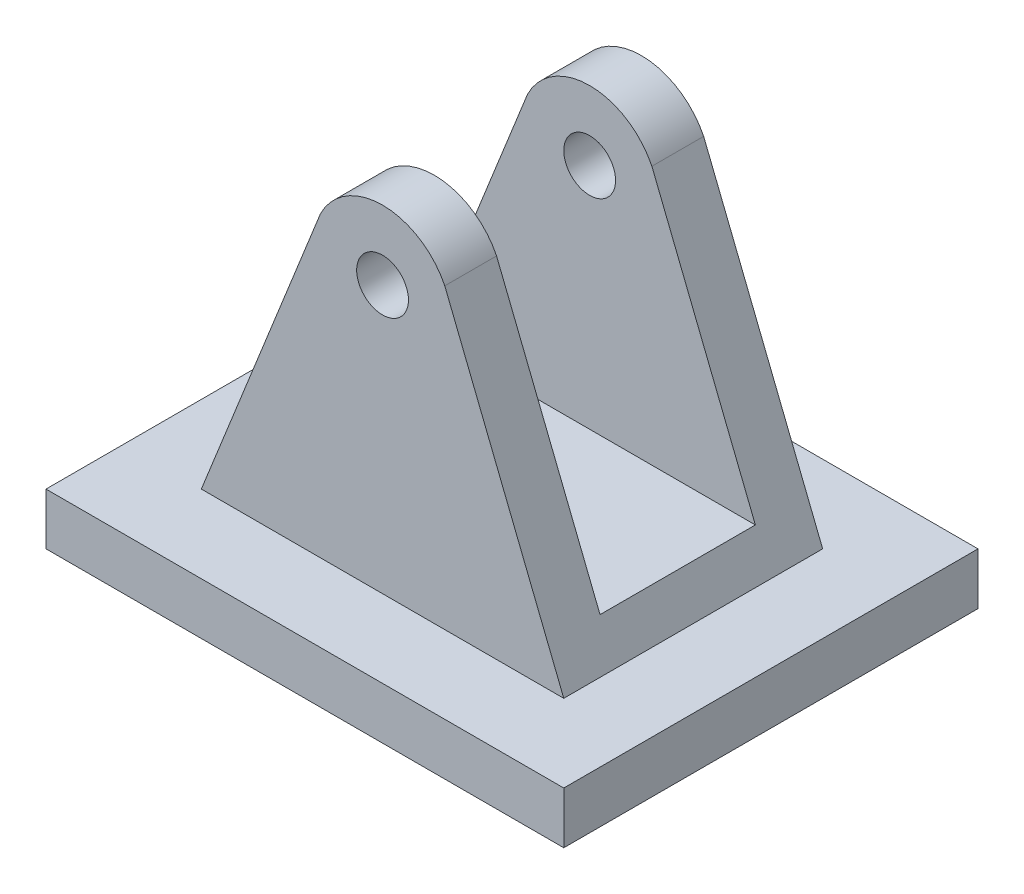
ISO-10303-21;
HEADER;
FILE_DESCRIPTION(('STEP AP214'),'2;1');
FILE_NAME('part.step','',(''),(''),'','','');
FILE_SCHEMA(('AUTOMOTIVE_DESIGN { 1 0 10303 214 1 1 1 1 }'));
ENDSEC;
DATA;
#1=APPLICATION_CONTEXT('core data for automotive mechanical design processes');
#2=APPLICATION_PROTOCOL_DEFINITION('international standard','automotive_design',2000,#1);
#3=PRODUCT_CONTEXT('',#1,'mechanical');
#4=PRODUCT('Part','Part','',(#3));
#5=PRODUCT_RELATED_PRODUCT_CATEGORY('part','',(#4));
#6=PRODUCT_DEFINITION_FORMATION('','',#4);
#7=PRODUCT_DEFINITION_CONTEXT('part definition',#1,'design');
#8=PRODUCT_DEFINITION('design','',#6,#7);
#9=PRODUCT_DEFINITION_SHAPE('','',#8);
#10=(LENGTH_UNIT() NAMED_UNIT(*) SI_UNIT(.MILLI.,.METRE.));
#11=(NAMED_UNIT(*) PLANE_ANGLE_UNIT() SI_UNIT($,.RADIAN.));
#12=(NAMED_UNIT(*) SI_UNIT($,.STERADIAN.) SOLID_ANGLE_UNIT());
#13=UNCERTAINTY_MEASURE_WITH_UNIT(LENGTH_MEASURE(1.E-05),#10,'distance_accuracy_value','');
#14=(GEOMETRIC_REPRESENTATION_CONTEXT(3) GLOBAL_UNCERTAINTY_ASSIGNED_CONTEXT((#13)) GLOBAL_UNIT_ASSIGNED_CONTEXT((#10,
#11,#12)) REPRESENTATION_CONTEXT('',''));
#15=CARTESIAN_POINT('',(0.,0.,0.));
#16=DIRECTION('',(0.,0.,1.));
#17=DIRECTION('',(1.,0.,0.));
#18=AXIS2_PLACEMENT_3D('',#15,#16,#17);
#19=CARTESIAN_POINT('',(-54.281045751634,75.,28.0718954248366));
#20=DIRECTION('',(0.,0.,-1.));
#21=DIRECTION('',(-1.,0.,0.));
#22=AXIS2_PLACEMENT_3D('',#19,#20,#21);
#23=PLANE('',#22);
#24=DIRECTION('',(-0.371153744479045,0.928571428571429,0.));
#25=VECTOR('',#24,1.);
#26=CARTESIAN_POINT('',(17.0000157292129,6.79497483980002,28.0718954248366));
#27=LINE('',#26,#25);
#28=CARTESIAN_POINT('',(15.718954248366,9.99999999999999,28.0718954248366));
#29=VERTEX_POINT('',#28);
#30=CARTESIAN_POINT('',(-7.26449090351148,67.5011590631464,28.0718954248366));
#31=VERTEX_POINT('',#30);
#32=EDGE_CURVE('E210',#29,#31,#27,.T.);
#33=ORIENTED_EDGE('',*,*,#32,.T.);
#34=CARTESIAN_POINT('',(-19.281045751634,61.6225855766485,28.0718954248366));
#35=DIRECTION('',(0.,0.,1.));
#36=DIRECTION('',(1.,0.,0.));
#37=AXIS2_PLACEMENT_3D('',#34,#35,#36);
#38=CIRCLE('',#37,13.3774144233515);
#39=CARTESIAN_POINT('',(-31.2976005997565,67.5011590631464,28.0718954248366));
#40=VERTEX_POINT('',#39);
#41=EDGE_CURVE('E197',#40,#31,#38,.F.);
#42=ORIENTED_EDGE('',*,*,#41,.F.);
#43=DIRECTION('',(0.371153744479045,0.928571428571429,0.));
#44=VECTOR('',#43,1.);
#45=CARTESIAN_POINT('',(-50.2499823825408,20.0851205921543,28.0718954248366));
#46=LINE('',#45,#44);
#47=CARTESIAN_POINT('',(-54.281045751634,9.99999999999999,28.0718954248366));
#48=VERTEX_POINT('',#47);
#49=EDGE_CURVE('E205',#48,#40,#46,.T.);
#50=ORIENTED_EDGE('',*,*,#49,.F.);
#51=DIRECTION('',(1.,0.,0.));
#52=VECTOR('',#51,1.);
#53=CARTESIAN_POINT('',(-54.281045751634,10.,28.0718954248366));
#54=LINE('',#53,#52);
#55=EDGE_CURVE('E219',#48,#29,#54,.T.);
#56=ORIENTED_EDGE('',*,*,#55,.T.);
#57=EDGE_LOOP('',(#33,#42,#50,#56));
#58=FACE_BOUND('',#57,.T.);
#59=CARTESIAN_POINT('',(-19.281045751634,61.6225855766485,28.0718954248366));
#60=DIRECTION('',(0.,0.,1.));
#61=DIRECTION('',(1.,0.,0.));
#62=AXIS2_PLACEMENT_3D('',#59,#60,#61);
#63=CIRCLE('',#62,5.);
#64=CARTESIAN_POINT('',(-14.281045751634,61.6225855766485,28.0718954248366));
#65=VERTEX_POINT('',#64);
#66=EDGE_CURVE('E221',#65,#65,#63,.T.);
#67=ORIENTED_EDGE('',*,*,#66,.F.);
#68=EDGE_LOOP('',(#67));
#69=FACE_BOUND('',#68,.T.);
#70=ADVANCED_FACE('F96',(#58,#69),#23,.F.);
#71=CARTESIAN_POINT('',(-54.281045751634,75.,-21.9281045751634));
#72=DIRECTION('',(0.,0.,1.));
#73=DIRECTION('',(1.,0.,0.));
#74=AXIS2_PLACEMENT_3D('',#71,#72,#73);
#75=PLANE('',#74);
#76=DIRECTION('',(-0.371153744479045,0.928571428571429,0.));
#77=VECTOR('',#76,1.);
#78=CARTESIAN_POINT('',(-16.3256824719764,90.1709117584849,-21.9281045751634));
#79=LINE('',#78,#77);
#80=CARTESIAN_POINT('',(15.718954248366,9.99999999999999,-21.9281045751634));
#81=VERTEX_POINT('',#80);
#82=CARTESIAN_POINT('',(-7.26449090351148,67.5011590631464,-21.9281045751634));
#83=VERTEX_POINT('',#82);
#84=EDGE_CURVE('E233',#81,#83,#79,.T.);
#85=ORIENTED_EDGE('',*,*,#84,.F.);
#86=DIRECTION('',(-1.,0.,0.));
#87=VECTOR('',#86,1.);
#88=CARTESIAN_POINT('',(-54.281045751634,10.,-21.9281045751634));
#89=LINE('',#88,#87);
#90=CARTESIAN_POINT('',(-54.281045751634,9.99999999999999,-21.9281045751634));
#91=VERTEX_POINT('',#90);
#92=EDGE_CURVE('E284',#81,#91,#89,.T.);
#93=ORIENTED_EDGE('',*,*,#92,.T.);
#94=DIRECTION('',(0.371153744479045,0.928571428571429,0.));
#95=VECTOR('',#94,1.);
#96=CARTESIAN_POINT('',(-31.8792661741488,66.0459183673469,-21.9281045751634));
#97=LINE('',#96,#95);
#98=CARTESIAN_POINT('',(-31.2976005997565,67.5011590631464,-21.9281045751634));
#99=VERTEX_POINT('',#98);
#100=EDGE_CURVE('E257',#91,#99,#97,.T.);
#101=ORIENTED_EDGE('',*,*,#100,.T.);
#102=CARTESIAN_POINT('',(-19.281045751634,61.6225855766485,-21.9281045751634));
#103=DIRECTION('',(0.,0.,1.));
#104=DIRECTION('',(1.,0.,0.));
#105=AXIS2_PLACEMENT_3D('',#102,#103,#104);
#106=CIRCLE('',#105,13.3774144233515);
#107=EDGE_CURVE('E265',#99,#83,#106,.F.);
#108=ORIENTED_EDGE('',*,*,#107,.T.);
#109=EDGE_LOOP('',(#85,#93,#101,#108));
#110=FACE_BOUND('',#109,.T.);
#111=CARTESIAN_POINT('',(-19.281045751634,61.6225855766485,-21.9281045751634));
#112=DIRECTION('',(0.,0.,1.));
#113=DIRECTION('',(1.,0.,0.));
#114=AXIS2_PLACEMENT_3D('',#111,#112,#113);
#115=CIRCLE('',#114,5.);
#116=CARTESIAN_POINT('',(-14.281045751634,61.6225855766485,-21.9281045751634));
#117=VERTEX_POINT('',#116);
#118=EDGE_CURVE('E240',#117,#117,#115,.T.);
#119=ORIENTED_EDGE('',*,*,#118,.T.);
#120=EDGE_LOOP('',(#119));
#121=FACE_BOUND('',#120,.T.);
#122=ADVANCED_FACE('F354',(#110,#121),#75,.F.);
#123=CARTESIAN_POINT('',(-78.281045751634,17.5,-11.9281045751634));
#124=DIRECTION('',(0.,-1.,0.));
#125=DIRECTION('',(0.,0.,-1.));
#126=AXIS2_PLACEMENT_3D('',#123,#124,#125);
#127=PLANE('',#126);
#128=DIRECTION('',(0.,0.,1.));
#129=VECTOR('',#128,1.);
#130=CARTESIAN_POINT('',(12.7211740044968,17.5,-11.9281045751634));
#131=LINE('',#130,#129);
#132=CARTESIAN_POINT('',(12.7211740044968,17.5,-11.9281045751634));
#133=VERTEX_POINT('',#132);
#134=CARTESIAN_POINT('',(12.7211740044968,17.5,18.0718954248366));
#135=VERTEX_POINT('',#134);
#136=EDGE_CURVE('E227',#133,#135,#131,.T.);
#137=ORIENTED_EDGE('',*,*,#136,.F.);
#138=DIRECTION('',(1.,0.,0.));
#139=VECTOR('',#138,1.);
#140=CARTESIAN_POINT('',(-78.281045751634,17.5,-11.9281045751634));
#141=LINE('',#140,#139);
#142=CARTESIAN_POINT('',(-51.2832655077648,17.5,-11.9281045751634));
#143=VERTEX_POINT('',#142);
#144=EDGE_CURVE('E269',#143,#133,#141,.T.);
#145=ORIENTED_EDGE('',*,*,#144,.F.);
#146=DIRECTION('',(0.,0.,1.));
#147=VECTOR('',#146,1.);
#148=CARTESIAN_POINT('',(-51.2832655077648,17.5,-11.9281045751634));
#149=LINE('',#148,#147);
#150=CARTESIAN_POINT('',(-51.2832655077648,17.5,18.0718954248366));
#151=VERTEX_POINT('',#150);
#152=EDGE_CURVE('E249',#143,#151,#149,.T.);
#153=ORIENTED_EDGE('',*,*,#152,.T.);
#154=DIRECTION('',(1.,0.,0.));
#155=VECTOR('',#154,1.);
#156=CARTESIAN_POINT('',(-78.281045751634,17.5,18.0718954248366));
#157=LINE('',#156,#155);
#158=EDGE_CURVE('E268',#151,#135,#157,.T.);
#159=ORIENTED_EDGE('',*,*,#158,.T.);
#160=EDGE_LOOP('',(#137,#145,#153,#159));
#161=FACE_BOUND('',#160,.T.);
#162=ADVANCED_FACE('F336',(#161),#127,.F.);
#163=CARTESIAN_POINT('',(-78.281045751634,67.5,-11.9281045751634));
#164=DIRECTION('',(0.,0.,-1.));
#165=DIRECTION('',(0.,1.,0.));
#166=AXIS2_PLACEMENT_3D('',#163,#164,#165);
#167=PLANE('',#166);
#168=DIRECTION('',(0.371153744479045,-0.928571428571429,0.));
#169=VECTOR('',#168,1.);
#170=CARTESIAN_POINT('',(-17.0469842004769,91.975501329324,-11.9281045751634));
#171=LINE('',#170,#169);
#172=CARTESIAN_POINT('',(-7.26449090351148,67.5011590631464,-11.9281045751634));
#173=VERTEX_POINT('',#172);
#174=EDGE_CURVE('E230',#173,#133,#171,.T.);
#175=ORIENTED_EDGE('',*,*,#174,.F.);
#176=CARTESIAN_POINT('',(-19.281045751634,61.6225855766485,-11.9281045751634));
#177=DIRECTION('',(0.,0.,-1.));
#178=DIRECTION('',(0.,1.,0.));
#179=AXIS2_PLACEMENT_3D('',#176,#177,#178);
#180=CIRCLE('',#179,13.3774144233515);
#181=CARTESIAN_POINT('',(-31.2976005997565,67.5011590631464,-11.9281045751634));
#182=VERTEX_POINT('',#181);
#183=EDGE_CURVE('E261',#173,#182,#180,.F.);
#184=ORIENTED_EDGE('',*,*,#183,.T.);
#185=DIRECTION('',(-0.371153744479045,-0.928571428571429,0.));
#186=VECTOR('',#185,1.);
#187=CARTESIAN_POINT('',(-37.7702093436074,51.30765532712,-11.9281045751634));
#188=LINE('',#187,#186);
#189=EDGE_CURVE('E253',#182,#143,#188,.T.);
#190=ORIENTED_EDGE('',*,*,#189,.T.);
#191=ORIENTED_EDGE('',*,*,#144,.T.);
#192=EDGE_LOOP('',(#175,#184,#190,#191));
#193=FACE_BOUND('',#192,.T.);
#194=CARTESIAN_POINT('',(-19.281045751634,61.6225855766485,-11.9281045751634));
#195=DIRECTION('',(0.,0.,-1.));
#196=DIRECTION('',(0.,1.,0.));
#197=AXIS2_PLACEMENT_3D('',#194,#195,#196);
#198=CIRCLE('',#197,5.);
#199=CARTESIAN_POINT('',(-19.281045751634,66.6225855766485,-11.9281045751634));
#200=VERTEX_POINT('',#199);
#201=EDGE_CURVE('E236',#200,#200,#198,.T.);
#202=ORIENTED_EDGE('',*,*,#201,.T.);
#203=EDGE_LOOP('',(#202));
#204=FACE_BOUND('',#203,.T.);
#205=ADVANCED_FACE('F339',(#193,#204),#167,.F.);
#206=CARTESIAN_POINT('',(-78.281045751634,17.5,18.0718954248366));
#207=DIRECTION('',(0.,0.,1.));
#208=DIRECTION('',(1.,0.,0.));
#209=AXIS2_PLACEMENT_3D('',#206,#207,#208);
#210=PLANE('',#209);
#211=DIRECTION('',(-0.371153744479045,0.928571428571429,0.));
#212=VECTOR('',#211,1.);
#213=CARTESIAN_POINT('',(0.185153936050203,48.8632564313648,18.0718954248366));
#214=LINE('',#213,#212);
#215=CARTESIAN_POINT('',(-7.26449090351148,67.5011590631464,18.0718954248366));
#216=VERTEX_POINT('',#215);
#217=EDGE_CURVE('E12',#135,#216,#214,.T.);
#218=ORIENTED_EDGE('',*,*,#217,.F.);
#219=ORIENTED_EDGE('',*,*,#158,.F.);
#220=DIRECTION('',(0.371153744479045,0.928571428571429,0.));
#221=VECTOR('',#220,1.);
#222=CARTESIAN_POINT('',(-55.0023474801345,8.19541042916087,18.0718954248366));
#223=LINE('',#222,#221);
#224=CARTESIAN_POINT('',(-31.2976005997565,67.5011590631464,18.0718954248366));
#225=VERTEX_POINT('',#224);
#226=EDGE_CURVE('E323',#151,#225,#223,.T.);
#227=ORIENTED_EDGE('',*,*,#226,.T.);
#228=CARTESIAN_POINT('',(-19.281045751634,61.6225855766485,18.0718954248366));
#229=DIRECTION('',(0.,0.,1.));
#230=DIRECTION('',(1.,0.,0.));
#231=AXIS2_PLACEMENT_3D('',#228,#229,#230);
#232=CIRCLE('',#231,13.3774144233515);
#233=EDGE_CURVE('E106',#225,#216,#232,.F.);
#234=ORIENTED_EDGE('',*,*,#233,.T.);
#235=EDGE_LOOP('',(#218,#219,#227,#234));
#236=FACE_BOUND('',#235,.T.);
#237=CARTESIAN_POINT('',(-19.281045751634,61.6225855766485,18.0718954248366));
#238=DIRECTION('',(0.,0.,1.));
#239=DIRECTION('',(1.,0.,0.));
#240=AXIS2_PLACEMENT_3D('',#237,#238,#239);
#241=CIRCLE('',#240,5.);
#242=CARTESIAN_POINT('',(-14.281045751634,61.6225855766485,18.0718954248366));
#243=VERTEX_POINT('',#242);
#244=EDGE_CURVE('E100',#243,#243,#241,.T.);
#245=ORIENTED_EDGE('',*,*,#244,.T.);
#246=EDGE_LOOP('',(#245));
#247=FACE_BOUND('',#246,.T.);
#248=ADVANCED_FACE('F329',(#236,#247),#210,.F.);
#249=CARTESIAN_POINT('',(-69.281045751634,10.,-36.9281045751634));
#250=DIRECTION('',(1.,0.,0.));
#251=DIRECTION('',(0.,0.,-1.));
#252=AXIS2_PLACEMENT_3D('',#249,#250,#251);
#253=PLANE('',#252);
#254=DIRECTION('',(0.,0.,1.));
#255=VECTOR('',#254,1.);
#256=CARTESIAN_POINT('',(-69.281045751634,0.,-36.9281045751634));
#257=LINE('',#256,#255);
#258=CARTESIAN_POINT('',(-69.281045751634,0.,-36.9281045751634));
#259=VERTEX_POINT('',#258);
#260=CARTESIAN_POINT('',(-69.281045751634,0.,43.0718954248366));
#261=VERTEX_POINT('',#260);
#262=EDGE_CURVE('E288',#259,#261,#257,.T.);
#263=ORIENTED_EDGE('',*,*,#262,.T.);
#264=DIRECTION('',(0.,-1.,0.));
#265=VECTOR('',#264,1.);
#266=CARTESIAN_POINT('',(-69.281045751634,10.,43.0718954248366));
#267=LINE('',#266,#265);
#268=CARTESIAN_POINT('',(-69.281045751634,10.,43.0718954248366));
#269=VERTEX_POINT('',#268);
#270=EDGE_CURVE('E320',#269,#261,#267,.T.);
#271=ORIENTED_EDGE('',*,*,#270,.F.);
#272=DIRECTION('',(0.,0.,1.));
#273=VECTOR('',#272,1.);
#274=CARTESIAN_POINT('',(-69.281045751634,10.,-36.9281045751634));
#275=LINE('',#274,#273);
#276=CARTESIAN_POINT('',(-69.281045751634,10.,-36.9281045751634));
#277=VERTEX_POINT('',#276);
#278=EDGE_CURVE('E289',#277,#269,#275,.T.);
#279=ORIENTED_EDGE('',*,*,#278,.F.);
#280=DIRECTION('',(0.,-1.,0.));
#281=VECTOR('',#280,1.);
#282=CARTESIAN_POINT('',(-69.281045751634,10.,-36.9281045751634));
#283=LINE('',#282,#281);
#284=EDGE_CURVE('E299',#277,#259,#283,.T.);
#285=ORIENTED_EDGE('',*,*,#284,.T.);
#286=EDGE_LOOP('',(#263,#271,#279,#285));
#287=FACE_BOUND('',#286,.T.);
#288=ADVANCED_FACE('F98',(#287),#253,.F.);
#289=CARTESIAN_POINT('',(-69.281045751634,10.,43.0718954248366));
#290=DIRECTION('',(0.,0.,-1.));
#291=DIRECTION('',(-1.,0.,0.));
#292=AXIS2_PLACEMENT_3D('',#289,#290,#291);
#293=PLANE('',#292);
#294=DIRECTION('',(1.,0.,0.));
#295=VECTOR('',#294,1.);
#296=CARTESIAN_POINT('',(-69.281045751634,0.,43.0718954248366));
#297=LINE('',#296,#295);
#298=CARTESIAN_POINT('',(30.718954248366,0.,43.0718954248366));
#299=VERTEX_POINT('',#298);
#300=EDGE_CURVE('E303',#261,#299,#297,.T.);
#301=ORIENTED_EDGE('',*,*,#300,.T.);
#302=DIRECTION('',(0.,-1.,0.));
#303=VECTOR('',#302,1.);
#304=CARTESIAN_POINT('',(30.718954248366,10.,43.0718954248366));
#305=LINE('',#304,#303);
#306=CARTESIAN_POINT('',(30.718954248366,10.,43.0718954248366));
#307=VERTEX_POINT('',#306);
#308=EDGE_CURVE('E316',#307,#299,#305,.T.);
#309=ORIENTED_EDGE('',*,*,#308,.F.);
#310=DIRECTION('',(1.,0.,0.));
#311=VECTOR('',#310,1.);
#312=CARTESIAN_POINT('',(-69.281045751634,10.,43.0718954248366));
#313=LINE('',#312,#311);
#314=EDGE_CURVE('E151',#269,#307,#313,.T.);
#315=ORIENTED_EDGE('',*,*,#314,.F.);
#316=ORIENTED_EDGE('',*,*,#270,.T.);
#317=EDGE_LOOP('',(#301,#309,#315,#316));
#318=FACE_BOUND('',#317,.T.);
#319=ADVANCED_FACE('F486',(#318),#293,.F.);
#320=CARTESIAN_POINT('',(30.718954248366,10.,-36.9281045751634));
#321=DIRECTION('',(-1.,0.,0.));
#322=DIRECTION('',(0.,0.,1.));
#323=AXIS2_PLACEMENT_3D('',#320,#321,#322);
#324=PLANE('',#323);
#325=DIRECTION('',(0.,0.,-1.));
#326=VECTOR('',#325,1.);
#327=CARTESIAN_POINT('',(30.718954248366,0.,-36.9281045751634));
#328=LINE('',#327,#326);
#329=CARTESIAN_POINT('',(30.718954248366,0.,-36.9281045751634));
#330=VERTEX_POINT('',#329);
#331=EDGE_CURVE('E306',#299,#330,#328,.T.);
#332=ORIENTED_EDGE('',*,*,#331,.T.);
#333=DIRECTION('',(0.,-1.,0.));
#334=VECTOR('',#333,1.);
#335=CARTESIAN_POINT('',(30.718954248366,10.,-36.9281045751634));
#336=LINE('',#335,#334);
#337=CARTESIAN_POINT('',(30.718954248366,10.,-36.9281045751634));
#338=VERTEX_POINT('',#337);
#339=EDGE_CURVE('E313',#338,#330,#336,.T.);
#340=ORIENTED_EDGE('',*,*,#339,.F.);
#341=DIRECTION('',(0.,0.,-1.));
#342=VECTOR('',#341,1.);
#343=CARTESIAN_POINT('',(30.718954248366,10.,-36.9281045751634));
#344=LINE('',#343,#342);
#345=EDGE_CURVE('E294',#307,#338,#344,.T.);
#346=ORIENTED_EDGE('',*,*,#345,.F.);
#347=ORIENTED_EDGE('',*,*,#308,.T.);
#348=EDGE_LOOP('',(#332,#340,#346,#347));
#349=FACE_BOUND('',#348,.T.);
#350=ADVANCED_FACE('F369',(#349),#324,.F.);
#351=CARTESIAN_POINT('',(-69.281045751634,10.,-36.9281045751634));
#352=DIRECTION('',(0.,0.,1.));
#353=DIRECTION('',(1.,0.,0.));
#354=AXIS2_PLACEMENT_3D('',#351,#352,#353);
#355=PLANE('',#354);
#356=DIRECTION('',(-1.,0.,0.));
#357=VECTOR('',#356,1.);
#358=CARTESIAN_POINT('',(-69.281045751634,0.,-36.9281045751634));
#359=LINE('',#358,#357);
#360=EDGE_CURVE('E143',#330,#259,#359,.T.);
#361=ORIENTED_EDGE('',*,*,#360,.T.);
#362=ORIENTED_EDGE('',*,*,#284,.F.);
#363=DIRECTION('',(-1.,0.,0.));
#364=VECTOR('',#363,1.);
#365=CARTESIAN_POINT('',(-69.281045751634,10.,-36.9281045751634));
#366=LINE('',#365,#364);
#367=EDGE_CURVE('E122',#338,#277,#366,.T.);
#368=ORIENTED_EDGE('',*,*,#367,.F.);
#369=ORIENTED_EDGE('',*,*,#339,.T.);
#370=EDGE_LOOP('',(#361,#362,#368,#369));
#371=FACE_BOUND('',#370,.T.);
#372=ADVANCED_FACE('F361',(#371),#355,.F.);
#373=CARTESIAN_POINT('',(0.,10.,0.));
#374=DIRECTION('',(0.,1.,0.));
#375=DIRECTION('',(0.,0.,1.));
#376=AXIS2_PLACEMENT_3D('',#373,#374,#375);
#377=PLANE('',#376);
#378=ORIENTED_EDGE('',*,*,#367,.T.);
#379=ORIENTED_EDGE('',*,*,#278,.T.);
#380=ORIENTED_EDGE('',*,*,#314,.T.);
#381=ORIENTED_EDGE('',*,*,#345,.T.);
#382=EDGE_LOOP('',(#378,#379,#380,#381));
#383=FACE_BOUND('',#382,.T.);
#384=DIRECTION('',(0.,0.,1.));
#385=VECTOR('',#384,1.);
#386=CARTESIAN_POINT('',(-54.281045751634,10.,28.0718954248366));
#387=LINE('',#386,#385);
#388=EDGE_CURVE('E273',#91,#48,#387,.T.);
#389=ORIENTED_EDGE('',*,*,#388,.F.);
#390=ORIENTED_EDGE('',*,*,#92,.F.);
#391=DIRECTION('',(0.,0.,-1.));
#392=VECTOR('',#391,1.);
#393=CARTESIAN_POINT('',(15.718954248366,10.,28.0718954248366));
#394=LINE('',#393,#392);
#395=EDGE_CURVE('E281',#29,#81,#394,.T.);
#396=ORIENTED_EDGE('',*,*,#395,.F.);
#397=ORIENTED_EDGE('',*,*,#55,.F.);
#398=EDGE_LOOP('',(#389,#390,#396,#397));
#399=FACE_BOUND('',#398,.T.);
#400=ADVANCED_FACE('F358',(#383,#399),#377,.T.);
#401=CARTESIAN_POINT('',(0.,0.,0.));
#402=DIRECTION('',(0.,1.,0.));
#403=DIRECTION('',(0.,0.,1.));
#404=AXIS2_PLACEMENT_3D('',#401,#402,#403);
#405=PLANE('',#404);
#406=ORIENTED_EDGE('',*,*,#262,.F.);
#407=ORIENTED_EDGE('',*,*,#360,.F.);
#408=ORIENTED_EDGE('',*,*,#331,.F.);
#409=ORIENTED_EDGE('',*,*,#300,.F.);
#410=EDGE_LOOP('',(#406,#407,#408,#409));
#411=FACE_BOUND('',#410,.T.);
#412=ADVANCED_FACE('F360',(#411),#405,.F.);
#413=CARTESIAN_POINT('',(-19.281045751634,61.6225855766485,-65.9281045751634));
#414=DIRECTION('',(0.,0.,1.));
#415=DIRECTION('',(1.,0.,0.));
#416=AXIS2_PLACEMENT_3D('',#413,#414,#415);
#417=CYLINDRICAL_SURFACE('',#416,13.3774144233515);
#418=DIRECTION('',(0.,0.,1.));
#419=VECTOR('',#418,1.);
#420=CARTESIAN_POINT('',(-31.2976005997565,67.5011590631464,-65.9281045751634));
#421=LINE('',#420,#419);
#422=EDGE_CURVE('E248',#99,#182,#421,.T.);
#423=ORIENTED_EDGE('',*,*,#422,.T.);
#424=ORIENTED_EDGE('',*,*,#183,.F.);
#425=DIRECTION('',(0.,0.,1.));
#426=VECTOR('',#425,1.);
#427=CARTESIAN_POINT('',(-7.26449090351148,67.5011590631464,-65.9281045751634));
#428=LINE('',#427,#426);
#429=EDGE_CURVE('E214',#83,#173,#428,.T.);
#430=ORIENTED_EDGE('',*,*,#429,.F.);
#431=ORIENTED_EDGE('',*,*,#107,.F.);
#432=EDGE_LOOP('',(#423,#424,#430,#431));
#433=FACE_BOUND('',#432,.T.);
#434=ADVANCED_FACE('F344',(#433),#417,.T.);
#435=EDGE_CURVE('E113',#225,#40,#421,.T.);
#436=ORIENTED_EDGE('',*,*,#435,.T.);
#437=ORIENTED_EDGE('',*,*,#41,.T.);
#438=EDGE_CURVE('E200',#216,#31,#428,.T.);
#439=ORIENTED_EDGE('',*,*,#438,.F.);
#440=ORIENTED_EDGE('',*,*,#233,.F.);
#441=EDGE_LOOP('',(#436,#437,#439,#440));
#442=FACE_BOUND('',#441,.T.);
#443=ADVANCED_FACE('F199',(#442),#417,.T.);
#444=CARTESIAN_POINT('',(-50.2499823825408,20.0851205921543,-65.9281045751634));
#445=DIRECTION('',(0.928571428571428,-0.371153744479045,0.));
#446=DIRECTION('',(0.371153744479045,0.928571428571429,0.));
#447=AXIS2_PLACEMENT_3D('',#444,#445,#446);
#448=PLANE('',#447);
#449=ORIENTED_EDGE('',*,*,#388,.T.);
#450=ORIENTED_EDGE('',*,*,#49,.T.);
#451=ORIENTED_EDGE('',*,*,#435,.F.);
#452=ORIENTED_EDGE('',*,*,#226,.F.);
#453=ORIENTED_EDGE('',*,*,#152,.F.);
#454=ORIENTED_EDGE('',*,*,#189,.F.);
#455=ORIENTED_EDGE('',*,*,#422,.F.);
#456=ORIENTED_EDGE('',*,*,#100,.F.);
#457=EDGE_LOOP('',(#449,#450,#451,#452,#453,#454,#455,#456));
#458=FACE_BOUND('',#457,.T.);
#459=ADVANCED_FACE('F332',(#458),#448,.F.);
#460=CARTESIAN_POINT('',(17.0000157292129,6.79497483980002,-65.9281045751634));
#461=DIRECTION('',(0.928571428571428,0.371153744479045,0.));
#462=DIRECTION('',(-0.371153744479045,0.928571428571429,0.));
#463=AXIS2_PLACEMENT_3D('',#460,#461,#462);
#464=PLANE('',#463);
#465=ORIENTED_EDGE('',*,*,#84,.T.);
#466=ORIENTED_EDGE('',*,*,#429,.T.);
#467=ORIENTED_EDGE('',*,*,#174,.T.);
#468=ORIENTED_EDGE('',*,*,#136,.T.);
#469=ORIENTED_EDGE('',*,*,#217,.T.);
#470=ORIENTED_EDGE('',*,*,#438,.T.);
#471=ORIENTED_EDGE('',*,*,#32,.F.);
#472=ORIENTED_EDGE('',*,*,#395,.T.);
#473=EDGE_LOOP('',(#465,#466,#467,#468,#469,#470,#471,#472));
#474=FACE_BOUND('',#473,.T.);
#475=ADVANCED_FACE('F209',(#474),#464,.T.);
#476=CARTESIAN_POINT('',(-19.281045751634,61.6225855766485,-65.9281045751634));
#477=DIRECTION('',(0.,0.,1.));
#478=DIRECTION('',(1.,0.,0.));
#479=AXIS2_PLACEMENT_3D('',#476,#477,#478);
#480=CYLINDRICAL_SURFACE('',#479,5.);
#481=ORIENTED_EDGE('',*,*,#66,.T.);
#482=EDGE_LOOP('',(#481));
#483=FACE_BOUND('',#482,.T.);
#484=ORIENTED_EDGE('',*,*,#244,.F.);
#485=EDGE_LOOP('',(#484));
#486=FACE_BOUND('',#485,.T.);
#487=ADVANCED_FACE('F390',(#483,#486),#480,.F.);
#488=ORIENTED_EDGE('',*,*,#201,.F.);
#489=EDGE_LOOP('',(#488));
#490=FACE_BOUND('',#489,.T.);
#491=ORIENTED_EDGE('',*,*,#118,.F.);
#492=EDGE_LOOP('',(#491));
#493=FACE_BOUND('',#492,.T.);
#494=ADVANCED_FACE('F391',(#490,#493),#480,.F.);
#495=CLOSED_SHELL('',(#70,#122,#162,#205,#248,#288,#319,#350,#372,#400,#412,#434,#443,#459,#475,
#487,#494));
#496=MANIFOLD_SOLID_BREP('B2',#495);
#497=ADVANCED_BREP_SHAPE_REPRESENTATION('',(#18,#496),#14);
#498=SHAPE_DEFINITION_REPRESENTATION(#9,#497);
ENDSEC;
END-ISO-10303-21;
